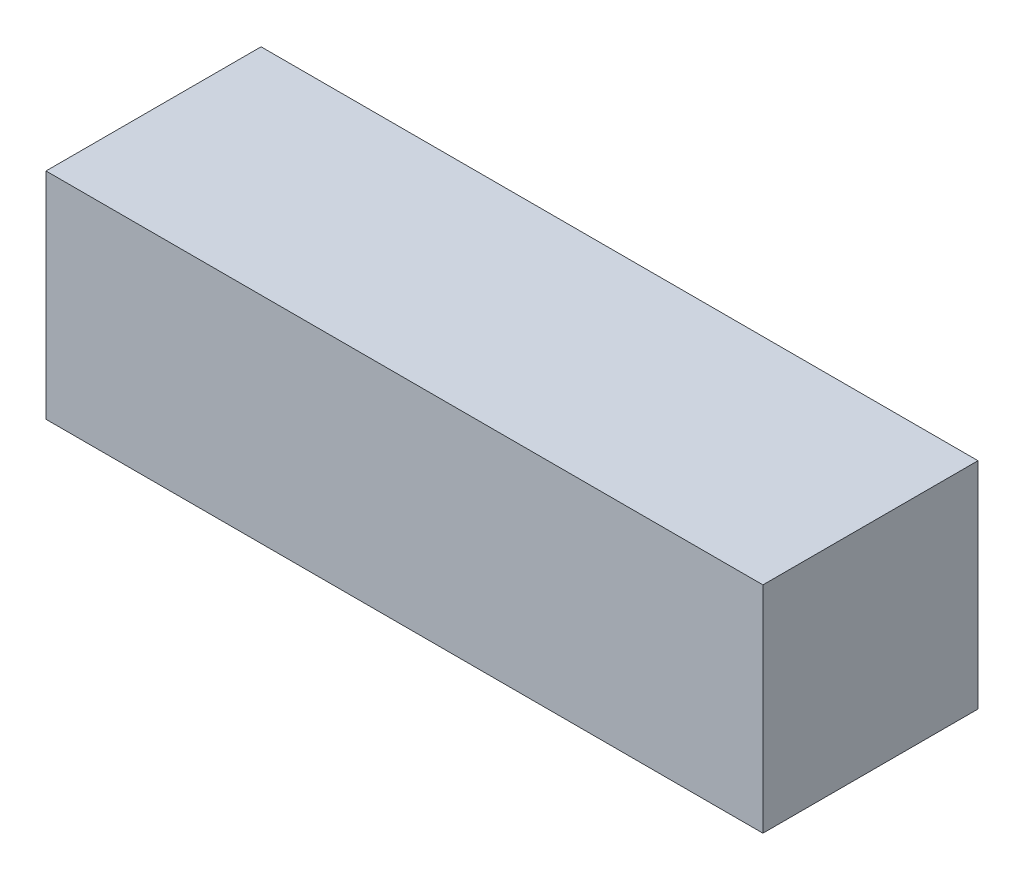
ISO-10303-21;
HEADER;
FILE_DESCRIPTION(('STEP AP214'),'2;1');
FILE_NAME('part.step','',(''),(''),'','','');
FILE_SCHEMA(('AUTOMOTIVE_DESIGN { 1 0 10303 214 1 1 1 1 }'));
ENDSEC;
DATA;
#1=APPLICATION_CONTEXT('core data for automotive mechanical design processes');
#2=APPLICATION_PROTOCOL_DEFINITION('international standard','automotive_design',2000,#1);
#3=PRODUCT_CONTEXT('',#1,'mechanical');
#4=PRODUCT('Part','Part','',(#3));
#5=PRODUCT_RELATED_PRODUCT_CATEGORY('part','',(#4));
#6=PRODUCT_DEFINITION_FORMATION('','',#4);
#7=PRODUCT_DEFINITION_CONTEXT('part definition',#1,'design');
#8=PRODUCT_DEFINITION('design','',#6,#7);
#9=PRODUCT_DEFINITION_SHAPE('','',#8);
#10=(LENGTH_UNIT() NAMED_UNIT(*) SI_UNIT(.MILLI.,.METRE.));
#11=(NAMED_UNIT(*) PLANE_ANGLE_UNIT() SI_UNIT($,.RADIAN.));
#12=(NAMED_UNIT(*) SI_UNIT($,.STERADIAN.) SOLID_ANGLE_UNIT());
#13=UNCERTAINTY_MEASURE_WITH_UNIT(LENGTH_MEASURE(1.E-05),#10,'distance_accuracy_value','');
#14=(GEOMETRIC_REPRESENTATION_CONTEXT(3) GLOBAL_UNCERTAINTY_ASSIGNED_CONTEXT((#13)) GLOBAL_UNIT_ASSIGNED_CONTEXT((#10,
#11,#12)) REPRESENTATION_CONTEXT('',''));
#15=CARTESIAN_POINT('',(0.,0.,0.));
#16=DIRECTION('',(0.,0.,1.));
#17=DIRECTION('',(1.,0.,0.));
#18=AXIS2_PLACEMENT_3D('',#15,#16,#17);
#19=CARTESIAN_POINT('',(127.,-19.05,-19.05));
#20=DIRECTION('',(0.,-1.,0.));
#21=DIRECTION('',(0.,0.,-1.));
#22=AXIS2_PLACEMENT_3D('',#19,#20,#21);
#23=PLANE('',#22);
#24=DIRECTION('',(0.,0.,1.));
#25=VECTOR('',#24,1.);
#26=CARTESIAN_POINT('',(0.,-19.05,-19.05));
#27=LINE('',#26,#25);
#28=CARTESIAN_POINT('',(0.,-19.05,-19.05));
#29=VERTEX_POINT('',#28);
#30=CARTESIAN_POINT('',(0.,-19.05,19.05));
#31=VERTEX_POINT('',#30);
#32=EDGE_CURVE('E110',#29,#31,#27,.T.);
#33=ORIENTED_EDGE('',*,*,#32,.F.);
#34=DIRECTION('',(-1.,0.,0.));
#35=VECTOR('',#34,1.);
#36=CARTESIAN_POINT('',(127.,-19.05,-19.05));
#37=LINE('',#36,#35);
#38=CARTESIAN_POINT('',(127.,-19.05,-19.05));
#39=VERTEX_POINT('',#38);
#40=EDGE_CURVE('E11',#39,#29,#37,.T.);
#41=ORIENTED_EDGE('',*,*,#40,.F.);
#42=DIRECTION('',(0.,0.,1.));
#43=VECTOR('',#42,1.);
#44=CARTESIAN_POINT('',(127.,-19.05,-19.05));
#45=LINE('',#44,#43);
#46=CARTESIAN_POINT('',(127.,-19.05,19.05));
#47=VERTEX_POINT('',#46);
#48=EDGE_CURVE('E103',#39,#47,#45,.T.);
#49=ORIENTED_EDGE('',*,*,#48,.T.);
#50=DIRECTION('',(-1.,0.,0.));
#51=VECTOR('',#50,1.);
#52=CARTESIAN_POINT('',(127.,-19.05,19.05));
#53=LINE('',#52,#51);
#54=EDGE_CURVE('E42',#47,#31,#53,.T.);
#55=ORIENTED_EDGE('',*,*,#54,.T.);
#56=EDGE_LOOP('',(#33,#41,#49,#55));
#57=FACE_BOUND('',#56,.T.);
#58=ADVANCED_FACE('F39',(#57),#23,.T.);
#59=CARTESIAN_POINT('',(127.,-19.05,-19.05));
#60=DIRECTION('',(0.,0.,1.));
#61=DIRECTION('',(1.,0.,0.));
#62=AXIS2_PLACEMENT_3D('',#59,#60,#61);
#63=PLANE('',#62);
#64=DIRECTION('',(0.,1.,0.));
#65=VECTOR('',#64,1.);
#66=CARTESIAN_POINT('',(0.,-19.05,-19.05));
#67=LINE('',#66,#65);
#68=CARTESIAN_POINT('',(0.,19.05,-19.05));
#69=VERTEX_POINT('',#68);
#70=EDGE_CURVE('E73',#29,#69,#67,.T.);
#71=ORIENTED_EDGE('',*,*,#70,.T.);
#72=DIRECTION('',(-1.,0.,0.));
#73=VECTOR('',#72,1.);
#74=CARTESIAN_POINT('',(127.,19.05,-19.05));
#75=LINE('',#74,#73);
#76=CARTESIAN_POINT('',(127.,19.05,-19.05));
#77=VERTEX_POINT('',#76);
#78=EDGE_CURVE('E49',#77,#69,#75,.T.);
#79=ORIENTED_EDGE('',*,*,#78,.F.);
#80=DIRECTION('',(0.,1.,0.));
#81=VECTOR('',#80,1.);
#82=CARTESIAN_POINT('',(127.,-19.05,-19.05));
#83=LINE('',#82,#81);
#84=EDGE_CURVE('E90',#39,#77,#83,.T.);
#85=ORIENTED_EDGE('',*,*,#84,.F.);
#86=ORIENTED_EDGE('',*,*,#40,.T.);
#87=EDGE_LOOP('',(#71,#79,#85,#86));
#88=FACE_BOUND('',#87,.T.);
#89=ADVANCED_FACE('F126',(#88),#63,.F.);
#90=CARTESIAN_POINT('',(127.,19.05,-19.05));
#91=DIRECTION('',(0.,-1.,0.));
#92=DIRECTION('',(0.,0.,-1.));
#93=AXIS2_PLACEMENT_3D('',#90,#91,#92);
#94=PLANE('',#93);
#95=DIRECTION('',(0.,0.,1.));
#96=VECTOR('',#95,1.);
#97=CARTESIAN_POINT('',(0.,19.05,-19.05));
#98=LINE('',#97,#96);
#99=CARTESIAN_POINT('',(0.,19.05,19.05));
#100=VERTEX_POINT('',#99);
#101=EDGE_CURVE('E98',#69,#100,#98,.T.);
#102=ORIENTED_EDGE('',*,*,#101,.T.);
#103=DIRECTION('',(-1.,0.,0.));
#104=VECTOR('',#103,1.);
#105=CARTESIAN_POINT('',(127.,19.05,19.05));
#106=LINE('',#105,#104);
#107=CARTESIAN_POINT('',(127.,19.05,19.05));
#108=VERTEX_POINT('',#107);
#109=EDGE_CURVE('E95',#108,#100,#106,.T.);
#110=ORIENTED_EDGE('',*,*,#109,.F.);
#111=DIRECTION('',(0.,0.,1.));
#112=VECTOR('',#111,1.);
#113=CARTESIAN_POINT('',(127.,19.05,-19.05));
#114=LINE('',#113,#112);
#115=EDGE_CURVE('E85',#77,#108,#114,.T.);
#116=ORIENTED_EDGE('',*,*,#115,.F.);
#117=ORIENTED_EDGE('',*,*,#78,.T.);
#118=EDGE_LOOP('',(#102,#110,#116,#117));
#119=FACE_BOUND('',#118,.T.);
#120=ADVANCED_FACE('F96',(#119),#94,.F.);
#121=CARTESIAN_POINT('',(127.,-19.05,19.05));
#122=DIRECTION('',(0.,0.,1.));
#123=DIRECTION('',(1.,0.,0.));
#124=AXIS2_PLACEMENT_3D('',#121,#122,#123);
#125=PLANE('',#124);
#126=DIRECTION('',(0.,1.,0.));
#127=VECTOR('',#126,1.);
#128=CARTESIAN_POINT('',(0.,-19.05,19.05));
#129=LINE('',#128,#127);
#130=EDGE_CURVE('E114',#31,#100,#129,.T.);
#131=ORIENTED_EDGE('',*,*,#130,.F.);
#132=ORIENTED_EDGE('',*,*,#54,.F.);
#133=DIRECTION('',(0.,1.,0.));
#134=VECTOR('',#133,1.);
#135=CARTESIAN_POINT('',(127.,-19.05,19.05));
#136=LINE('',#135,#134);
#137=EDGE_CURVE('E89',#47,#108,#136,.T.);
#138=ORIENTED_EDGE('',*,*,#137,.T.);
#139=ORIENTED_EDGE('',*,*,#109,.T.);
#140=EDGE_LOOP('',(#131,#132,#138,#139));
#141=FACE_BOUND('',#140,.T.);
#142=ADVANCED_FACE('F101',(#141),#125,.T.);
#143=CARTESIAN_POINT('',(127.,0.,0.));
#144=DIRECTION('',(-1.,0.,0.));
#145=DIRECTION('',(0.,0.,1.));
#146=AXIS2_PLACEMENT_3D('',#143,#144,#145);
#147=PLANE('',#146);
#148=ORIENTED_EDGE('',*,*,#48,.F.);
#149=ORIENTED_EDGE('',*,*,#84,.T.);
#150=ORIENTED_EDGE('',*,*,#115,.T.);
#151=ORIENTED_EDGE('',*,*,#137,.F.);
#152=EDGE_LOOP('',(#148,#149,#150,#151));
#153=FACE_BOUND('',#152,.T.);
#154=ADVANCED_FACE('F88',(#153),#147,.F.);
#155=CARTESIAN_POINT('',(0.,0.,0.));
#156=DIRECTION('',(-1.,0.,0.));
#157=DIRECTION('',(0.,0.,1.));
#158=AXIS2_PLACEMENT_3D('',#155,#156,#157);
#159=PLANE('',#158);
#160=ORIENTED_EDGE('',*,*,#32,.T.);
#161=ORIENTED_EDGE('',*,*,#130,.T.);
#162=ORIENTED_EDGE('',*,*,#101,.F.);
#163=ORIENTED_EDGE('',*,*,#70,.F.);
#164=EDGE_LOOP('',(#160,#161,#162,#163));
#165=FACE_BOUND('',#164,.T.);
#166=ADVANCED_FACE('F123',(#165),#159,.T.);
#167=CLOSED_SHELL('',(#58,#89,#120,#142,#154,#166));
#168=MANIFOLD_SOLID_BREP('B2',#167);
#169=ADVANCED_BREP_SHAPE_REPRESENTATION('',(#18,#168),#14);
#170=SHAPE_DEFINITION_REPRESENTATION(#9,#169);
ENDSEC;
END-ISO-10303-21;
